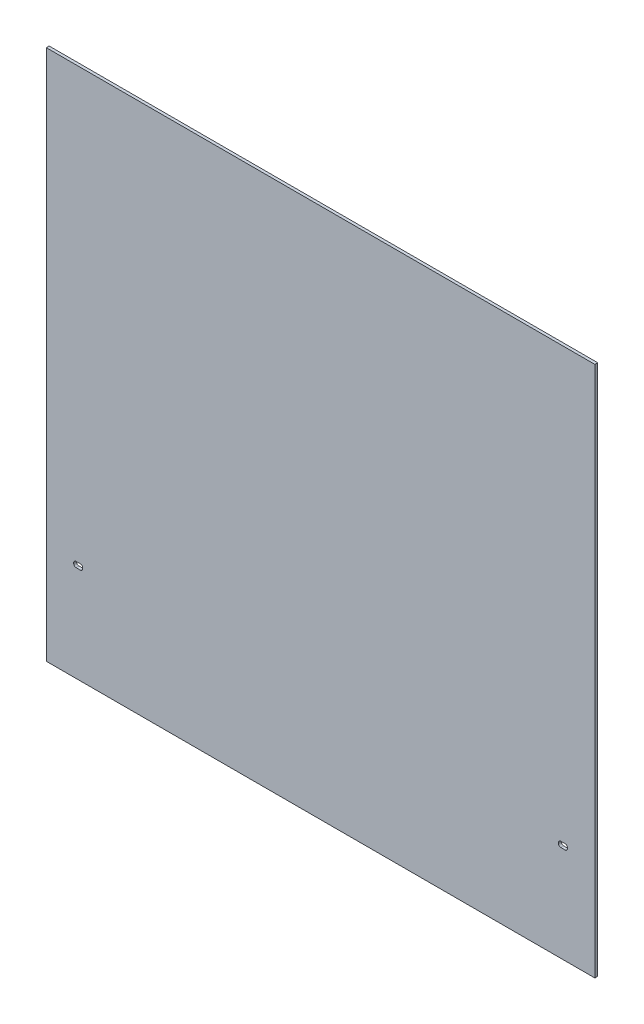
ISO-10303-21;
HEADER;
FILE_DESCRIPTION(('STEP AP214'),'2;1');
FILE_NAME('part.step','',(''),(''),'','','');
FILE_SCHEMA(('AUTOMOTIVE_DESIGN { 1 0 10303 214 1 1 1 1 }'));
ENDSEC;
DATA;
#1=APPLICATION_CONTEXT('core data for automotive mechanical design processes');
#2=APPLICATION_PROTOCOL_DEFINITION('international standard','automotive_design',2000,#1);
#3=PRODUCT_CONTEXT('',#1,'mechanical');
#4=PRODUCT('Part','Part','',(#3));
#5=PRODUCT_RELATED_PRODUCT_CATEGORY('part','',(#4));
#6=PRODUCT_DEFINITION_FORMATION('','',#4);
#7=PRODUCT_DEFINITION_CONTEXT('part definition',#1,'design');
#8=PRODUCT_DEFINITION('design','',#6,#7);
#9=PRODUCT_DEFINITION_SHAPE('','',#8);
#10=(LENGTH_UNIT() NAMED_UNIT(*) SI_UNIT(.MILLI.,.METRE.));
#11=(NAMED_UNIT(*) PLANE_ANGLE_UNIT() SI_UNIT($,.RADIAN.));
#12=(NAMED_UNIT(*) SI_UNIT($,.STERADIAN.) SOLID_ANGLE_UNIT());
#13=UNCERTAINTY_MEASURE_WITH_UNIT(LENGTH_MEASURE(1.E-05),#10,'distance_accuracy_value','');
#14=(GEOMETRIC_REPRESENTATION_CONTEXT(3) GLOBAL_UNCERTAINTY_ASSIGNED_CONTEXT((#13)) GLOBAL_UNIT_ASSIGNED_CONTEXT((#10,
#11,#12)) REPRESENTATION_CONTEXT('',''));
#15=CARTESIAN_POINT('',(0.,0.,0.));
#16=DIRECTION('',(0.,0.,1.));
#17=DIRECTION('',(1.,0.,0.));
#18=AXIS2_PLACEMENT_3D('',#15,#16,#17);
#19=CARTESIAN_POINT('',(0.,0.,3.175));
#20=DIRECTION('',(0.,0.,1.));
#21=DIRECTION('',(1.,0.,0.));
#22=AXIS2_PLACEMENT_3D('',#19,#20,#21);
#23=PLANE('',#22);
#24=DIRECTION('',(0.,1.,0.));
#25=VECTOR('',#24,1.);
#26=CARTESIAN_POINT('',(0.,0.,3.175));
#27=LINE('',#26,#25);
#28=CARTESIAN_POINT('',(0.,0.,3.175));
#29=VERTEX_POINT('',#28);
#30=CARTESIAN_POINT('',(-1.27832667954905E-13,590.55,3.175));
#31=VERTEX_POINT('',#30);
#32=EDGE_CURVE('E304',#29,#31,#27,.T.);
#33=ORIENTED_EDGE('',*,*,#32,.T.);
#34=DIRECTION('',(-1.,0.,0.));
#35=VECTOR('',#34,1.);
#36=CARTESIAN_POINT('',(-1.27832667954905E-13,590.55,3.175));
#37=LINE('',#36,#35);
#38=CARTESIAN_POINT('',(-609.6,590.55,3.175));
#39=VERTEX_POINT('',#38);
#40=EDGE_CURVE('E307',#31,#39,#37,.T.);
#41=ORIENTED_EDGE('',*,*,#40,.T.);
#42=DIRECTION('',(0.,-1.,0.));
#43=VECTOR('',#42,1.);
#44=CARTESIAN_POINT('',(-609.6,0.,3.175));
#45=LINE('',#44,#43);
#46=CARTESIAN_POINT('',(-609.6,0.,3.175));
#47=VERTEX_POINT('',#46);
#48=EDGE_CURVE('E310',#39,#47,#45,.T.);
#49=ORIENTED_EDGE('',*,*,#48,.T.);
#50=DIRECTION('',(1.,0.,0.));
#51=VECTOR('',#50,1.);
#52=CARTESIAN_POINT('',(0.,0.,3.175));
#53=LINE('',#52,#51);
#54=EDGE_CURVE('E312',#47,#29,#53,.T.);
#55=ORIENTED_EDGE('',*,*,#54,.T.);
#56=EDGE_LOOP('',(#33,#41,#49,#55));
#57=FACE_BOUND('',#56,.T.);
#58=DIRECTION('',(1.,0.,0.));
#59=VECTOR('',#58,1.);
#60=CARTESIAN_POINT('',(-576.62,106.68,3.175));
#61=LINE('',#60,#59);
#62=CARTESIAN_POINT('',(-576.62,106.68,3.175));
#63=VERTEX_POINT('',#62);
#64=CARTESIAN_POINT('',(-571.62,106.68,3.175));
#65=VERTEX_POINT('',#64);
#66=EDGE_CURVE('E247',#63,#65,#61,.T.);
#67=ORIENTED_EDGE('',*,*,#66,.F.);
#68=CARTESIAN_POINT('',(-576.62,109.18,3.175));
#69=DIRECTION('',(0.,0.,1.));
#70=DIRECTION('',(1.,0.,0.));
#71=AXIS2_PLACEMENT_3D('',#68,#69,#70);
#72=CIRCLE('',#71,2.50000000000001);
#73=CARTESIAN_POINT('',(-579.12,109.18,3.175));
#74=VERTEX_POINT('',#73);
#75=EDGE_CURVE('E245',#74,#63,#72,.T.);
#76=ORIENTED_EDGE('',*,*,#75,.F.);
#77=DIRECTION('',(-1.11022302462486E-13,-1.,0.));
#78=VECTOR('',#77,1.);
#79=CARTESIAN_POINT('',(-579.12,109.18,3.175));
#80=LINE('',#79,#78);
#81=CARTESIAN_POINT('',(-579.12,110.18,3.175));
#82=VERTEX_POINT('',#81);
#83=EDGE_CURVE('E261',#82,#74,#80,.T.);
#84=ORIENTED_EDGE('',*,*,#83,.F.);
#85=CARTESIAN_POINT('',(-576.62,110.18,3.175));
#86=DIRECTION('',(0.,0.,1.));
#87=DIRECTION('',(-1.,0.,0.));
#88=AXIS2_PLACEMENT_3D('',#85,#86,#87);
#89=CIRCLE('',#88,2.49999999999986);
#90=CARTESIAN_POINT('',(-576.62,112.68,3.175));
#91=VERTEX_POINT('',#90);
#92=EDGE_CURVE('E258',#91,#82,#89,.T.);
#93=ORIENTED_EDGE('',*,*,#92,.F.);
#94=DIRECTION('',(-1.,0.,0.));
#95=VECTOR('',#94,1.);
#96=CARTESIAN_POINT('',(-576.62,112.68,3.175));
#97=LINE('',#96,#95);
#98=CARTESIAN_POINT('',(-571.62,112.68,3.175));
#99=VERTEX_POINT('',#98);
#100=EDGE_CURVE('E256',#99,#91,#97,.T.);
#101=ORIENTED_EDGE('',*,*,#100,.F.);
#102=CARTESIAN_POINT('',(-571.62,110.18,3.175));
#103=DIRECTION('',(0.,0.,1.));
#104=DIRECTION('',(1.,0.,0.));
#105=AXIS2_PLACEMENT_3D('',#102,#103,#104);
#106=CIRCLE('',#105,2.49999999999998);
#107=CARTESIAN_POINT('',(-569.12,110.18,3.175));
#108=VERTEX_POINT('',#107);
#109=EDGE_CURVE('E254',#108,#99,#106,.T.);
#110=ORIENTED_EDGE('',*,*,#109,.F.);
#111=DIRECTION('',(1.11022302462479E-13,1.,0.));
#112=VECTOR('',#111,1.);
#113=CARTESIAN_POINT('',(-569.12,109.18,3.175));
#114=LINE('',#113,#112);
#115=CARTESIAN_POINT('',(-569.12,109.18,3.175));
#116=VERTEX_POINT('',#115);
#117=EDGE_CURVE('E252',#116,#108,#114,.T.);
#118=ORIENTED_EDGE('',*,*,#117,.F.);
#119=CARTESIAN_POINT('',(-571.62,109.18,3.175));
#120=DIRECTION('',(0.,0.,1.));
#121=DIRECTION('',(1.,0.,0.));
#122=AXIS2_PLACEMENT_3D('',#119,#120,#121);
#123=CIRCLE('',#122,2.4999999999999);
#124=EDGE_CURVE('E250',#65,#116,#123,.T.);
#125=ORIENTED_EDGE('',*,*,#124,.F.);
#126=EDGE_LOOP('',(#67,#76,#84,#93,#101,#110,#118,#125));
#127=FACE_BOUND('',#126,.T.);
#128=DIRECTION('',(0.,1.,0.));
#129=VECTOR('',#128,1.);
#130=CARTESIAN_POINT('',(-30.48,109.180000000001,3.175));
#131=LINE('',#130,#129);
#132=CARTESIAN_POINT('',(-30.48,109.180000000001,3.175));
#133=VERTEX_POINT('',#132);
#134=CARTESIAN_POINT('',(-30.48,110.180000000001,3.175));
#135=VERTEX_POINT('',#134);
#136=EDGE_CURVE('E188',#133,#135,#131,.T.);
#137=ORIENTED_EDGE('',*,*,#136,.F.);
#138=CARTESIAN_POINT('',(-32.9799999999999,109.180000000001,3.175));
#139=DIRECTION('',(0.,0.,1.));
#140=DIRECTION('',(-1.,0.,0.));
#141=AXIS2_PLACEMENT_3D('',#138,#139,#140);
#142=CIRCLE('',#141,2.49999999999995);
#143=CARTESIAN_POINT('',(-32.9799999999999,106.680000000001,3.175));
#144=VERTEX_POINT('',#143);
#145=EDGE_CURVE('E180',#144,#133,#142,.T.);
#146=ORIENTED_EDGE('',*,*,#145,.F.);
#147=DIRECTION('',(1.,0.,0.));
#148=VECTOR('',#147,1.);
#149=CARTESIAN_POINT('',(-32.9799999999999,106.680000000001,3.175));
#150=LINE('',#149,#148);
#151=CARTESIAN_POINT('',(-37.9800000000002,106.680000000001,3.175));
#152=VERTEX_POINT('',#151);
#153=EDGE_CURVE('E213',#152,#144,#150,.T.);
#154=ORIENTED_EDGE('',*,*,#153,.F.);
#155=CARTESIAN_POINT('',(-37.9800000000002,109.180000000001,3.175));
#156=DIRECTION('',(0.,0.,1.));
#157=DIRECTION('',(-1.,0.,0.));
#158=AXIS2_PLACEMENT_3D('',#155,#156,#157);
#159=CIRCLE('',#158,2.50000000000002);
#160=CARTESIAN_POINT('',(-40.4800000000003,109.180000000001,3.175));
#161=VERTEX_POINT('',#160);
#162=EDGE_CURVE('E211',#161,#152,#159,.T.);
#163=ORIENTED_EDGE('',*,*,#162,.F.);
#164=DIRECTION('',(0.,-1.,0.));
#165=VECTOR('',#164,1.);
#166=CARTESIAN_POINT('',(-40.4800000000003,109.180000000001,3.175));
#167=LINE('',#166,#165);
#168=CARTESIAN_POINT('',(-40.4800000000002,110.180000000001,3.175));
#169=VERTEX_POINT('',#168);
#170=EDGE_CURVE('E209',#169,#161,#167,.T.);
#171=ORIENTED_EDGE('',*,*,#170,.F.);
#172=CARTESIAN_POINT('',(-37.9800000000002,110.180000000001,3.175));
#173=DIRECTION('',(0.,0.,1.));
#174=DIRECTION('',(-1.,0.,0.));
#175=AXIS2_PLACEMENT_3D('',#172,#173,#174);
#176=CIRCLE('',#175,2.5);
#177=CARTESIAN_POINT('',(-37.9800000000002,112.680000000001,3.175));
#178=VERTEX_POINT('',#177);
#179=EDGE_CURVE('E207',#178,#169,#176,.T.);
#180=ORIENTED_EDGE('',*,*,#179,.F.);
#181=DIRECTION('',(-1.,0.,0.));
#182=VECTOR('',#181,1.);
#183=CARTESIAN_POINT('',(-32.9799999999999,112.680000000001,3.175));
#184=LINE('',#183,#182);
#185=CARTESIAN_POINT('',(-32.9799999999999,112.680000000001,3.175));
#186=VERTEX_POINT('',#185);
#187=EDGE_CURVE('E203',#186,#178,#184,.T.);
#188=ORIENTED_EDGE('',*,*,#187,.F.);
#189=CARTESIAN_POINT('',(-32.9799999999999,110.180000000001,3.175));
#190=DIRECTION('',(0.,0.,1.));
#191=DIRECTION('',(1.,0.,0.));
#192=AXIS2_PLACEMENT_3D('',#189,#190,#191);
#193=CIRCLE('',#192,2.49999999999995);
#194=EDGE_CURVE('E201',#135,#186,#193,.T.);
#195=ORIENTED_EDGE('',*,*,#194,.F.);
#196=EDGE_LOOP('',(#137,#146,#154,#163,#171,#180,#188,#195));
#197=FACE_BOUND('',#196,.T.);
#198=ADVANCED_FACE('F43',(#57,#127,#197),#23,.T.);
#199=CARTESIAN_POINT('',(0.,0.,0.));
#200=DIRECTION('',(0.,0.,1.));
#201=DIRECTION('',(1.,0.,0.));
#202=AXIS2_PLACEMENT_3D('',#199,#200,#201);
#203=PLANE('',#202);
#204=CARTESIAN_POINT('',(-576.62,109.18,0.));
#205=DIRECTION('',(0.,0.,1.));
#206=DIRECTION('',(1.,0.,0.));
#207=AXIS2_PLACEMENT_3D('',#204,#205,#206);
#208=CIRCLE('',#207,2.50000000000001);
#209=CARTESIAN_POINT('',(-579.12,109.18,0.));
#210=VERTEX_POINT('',#209);
#211=CARTESIAN_POINT('',(-576.62,106.68,0.));
#212=VERTEX_POINT('',#211);
#213=EDGE_CURVE('E196',#210,#212,#208,.T.);
#214=ORIENTED_EDGE('',*,*,#213,.T.);
#215=DIRECTION('',(1.,0.,0.));
#216=VECTOR('',#215,1.);
#217=CARTESIAN_POINT('',(-576.62,106.68,0.));
#218=LINE('',#217,#216);
#219=CARTESIAN_POINT('',(-571.62,106.68,0.));
#220=VERTEX_POINT('',#219);
#221=EDGE_CURVE('E266',#212,#220,#218,.T.);
#222=ORIENTED_EDGE('',*,*,#221,.T.);
#223=CARTESIAN_POINT('',(-571.62,109.18,0.));
#224=DIRECTION('',(0.,0.,1.));
#225=DIRECTION('',(1.,0.,0.));
#226=AXIS2_PLACEMENT_3D('',#223,#224,#225);
#227=CIRCLE('',#226,2.4999999999999);
#228=CARTESIAN_POINT('',(-569.12,109.18,0.));
#229=VERTEX_POINT('',#228);
#230=EDGE_CURVE('E269',#220,#229,#227,.T.);
#231=ORIENTED_EDGE('',*,*,#230,.T.);
#232=DIRECTION('',(1.11022302462479E-13,1.,0.));
#233=VECTOR('',#232,1.);
#234=CARTESIAN_POINT('',(-569.12,109.18,0.));
#235=LINE('',#234,#233);
#236=CARTESIAN_POINT('',(-569.12,110.18,0.));
#237=VERTEX_POINT('',#236);
#238=EDGE_CURVE('E272',#229,#237,#235,.T.);
#239=ORIENTED_EDGE('',*,*,#238,.T.);
#240=CARTESIAN_POINT('',(-571.62,110.18,0.));
#241=DIRECTION('',(0.,0.,1.));
#242=DIRECTION('',(1.,0.,0.));
#243=AXIS2_PLACEMENT_3D('',#240,#241,#242);
#244=CIRCLE('',#243,2.49999999999998);
#245=CARTESIAN_POINT('',(-571.62,112.68,0.));
#246=VERTEX_POINT('',#245);
#247=EDGE_CURVE('E275',#237,#246,#244,.T.);
#248=ORIENTED_EDGE('',*,*,#247,.T.);
#249=DIRECTION('',(-1.,0.,0.));
#250=VECTOR('',#249,1.);
#251=CARTESIAN_POINT('',(-576.62,112.68,0.));
#252=LINE('',#251,#250);
#253=CARTESIAN_POINT('',(-576.62,112.68,0.));
#254=VERTEX_POINT('',#253);
#255=EDGE_CURVE('E278',#246,#254,#252,.T.);
#256=ORIENTED_EDGE('',*,*,#255,.T.);
#257=CARTESIAN_POINT('',(-576.62,110.18,0.));
#258=DIRECTION('',(0.,0.,1.));
#259=DIRECTION('',(-1.,0.,0.));
#260=AXIS2_PLACEMENT_3D('',#257,#258,#259);
#261=CIRCLE('',#260,2.49999999999986);
#262=CARTESIAN_POINT('',(-579.12,110.18,0.));
#263=VERTEX_POINT('',#262);
#264=EDGE_CURVE('E281',#254,#263,#261,.T.);
#265=ORIENTED_EDGE('',*,*,#264,.T.);
#266=DIRECTION('',(-1.11022302462486E-13,-1.,0.));
#267=VECTOR('',#266,1.);
#268=CARTESIAN_POINT('',(-579.12,109.18,0.));
#269=LINE('',#268,#267);
#270=EDGE_CURVE('E248',#263,#210,#269,.T.);
#271=ORIENTED_EDGE('',*,*,#270,.T.);
#272=EDGE_LOOP('',(#214,#222,#231,#239,#248,#256,#265,#271));
#273=FACE_BOUND('',#272,.T.);
#274=DIRECTION('',(0.,1.,0.));
#275=VECTOR('',#274,1.);
#276=CARTESIAN_POINT('',(0.,0.,0.));
#277=LINE('',#276,#275);
#278=CARTESIAN_POINT('',(0.,0.,0.));
#279=VERTEX_POINT('',#278);
#280=CARTESIAN_POINT('',(-1.27832667954905E-13,590.55,0.));
#281=VERTEX_POINT('',#280);
#282=EDGE_CURVE('E303',#279,#281,#277,.T.);
#283=ORIENTED_EDGE('',*,*,#282,.F.);
#284=DIRECTION('',(1.,0.,0.));
#285=VECTOR('',#284,1.);
#286=CARTESIAN_POINT('',(0.,0.,0.));
#287=LINE('',#286,#285);
#288=CARTESIAN_POINT('',(-609.6,0.,0.));
#289=VERTEX_POINT('',#288);
#290=EDGE_CURVE('E308',#289,#279,#287,.T.);
#291=ORIENTED_EDGE('',*,*,#290,.F.);
#292=DIRECTION('',(0.,-1.,0.));
#293=VECTOR('',#292,1.);
#294=CARTESIAN_POINT('',(-609.6,0.,0.));
#295=LINE('',#294,#293);
#296=CARTESIAN_POINT('',(-609.6,590.55,0.));
#297=VERTEX_POINT('',#296);
#298=EDGE_CURVE('E319',#297,#289,#295,.T.);
#299=ORIENTED_EDGE('',*,*,#298,.F.);
#300=DIRECTION('',(-1.,0.,0.));
#301=VECTOR('',#300,1.);
#302=CARTESIAN_POINT('',(-1.27832667954905E-13,590.55,0.));
#303=LINE('',#302,#301);
#304=EDGE_CURVE('E317',#281,#297,#303,.T.);
#305=ORIENTED_EDGE('',*,*,#304,.F.);
#306=EDGE_LOOP('',(#283,#291,#299,#305));
#307=FACE_BOUND('',#306,.T.);
#308=CARTESIAN_POINT('',(-32.9799999999999,109.180000000001,0.));
#309=DIRECTION('',(0.,0.,1.));
#310=DIRECTION('',(-1.,0.,0.));
#311=AXIS2_PLACEMENT_3D('',#308,#309,#310);
#312=CIRCLE('',#311,2.49999999999995);
#313=CARTESIAN_POINT('',(-32.9799999999999,106.680000000001,0.));
#314=VERTEX_POINT('',#313);
#315=CARTESIAN_POINT('',(-30.48,109.180000000001,0.));
#316=VERTEX_POINT('',#315);
#317=EDGE_CURVE('E66',#314,#316,#312,.T.);
#318=ORIENTED_EDGE('',*,*,#317,.T.);
#319=DIRECTION('',(0.,1.,0.));
#320=VECTOR('',#319,1.);
#321=CARTESIAN_POINT('',(-30.48,109.180000000001,0.));
#322=LINE('',#321,#320);
#323=CARTESIAN_POINT('',(-30.48,110.180000000001,0.));
#324=VERTEX_POINT('',#323);
#325=EDGE_CURVE('E195',#316,#324,#322,.T.);
#326=ORIENTED_EDGE('',*,*,#325,.T.);
#327=CARTESIAN_POINT('',(-32.9799999999999,110.180000000001,0.));
#328=DIRECTION('',(0.,0.,1.));
#329=DIRECTION('',(1.,0.,0.));
#330=AXIS2_PLACEMENT_3D('',#327,#328,#329);
#331=CIRCLE('',#330,2.49999999999995);
#332=CARTESIAN_POINT('',(-32.9799999999999,112.680000000001,0.));
#333=VERTEX_POINT('',#332);
#334=EDGE_CURVE('E217',#324,#333,#331,.T.);
#335=ORIENTED_EDGE('',*,*,#334,.T.);
#336=DIRECTION('',(-1.,0.,0.));
#337=VECTOR('',#336,1.);
#338=CARTESIAN_POINT('',(-32.9799999999999,112.680000000001,0.));
#339=LINE('',#338,#337);
#340=CARTESIAN_POINT('',(-37.9800000000002,112.680000000001,0.));
#341=VERTEX_POINT('',#340);
#342=EDGE_CURVE('E220',#333,#341,#339,.T.);
#343=ORIENTED_EDGE('',*,*,#342,.T.);
#344=CARTESIAN_POINT('',(-37.9800000000002,110.180000000001,0.));
#345=DIRECTION('',(0.,0.,1.));
#346=DIRECTION('',(-1.,0.,0.));
#347=AXIS2_PLACEMENT_3D('',#344,#345,#346);
#348=CIRCLE('',#347,2.5);
#349=CARTESIAN_POINT('',(-40.4800000000002,110.180000000001,0.));
#350=VERTEX_POINT('',#349);
#351=EDGE_CURVE('E223',#341,#350,#348,.T.);
#352=ORIENTED_EDGE('',*,*,#351,.T.);
#353=DIRECTION('',(0.,-1.,0.));
#354=VECTOR('',#353,1.);
#355=CARTESIAN_POINT('',(-40.4800000000003,109.180000000001,0.));
#356=LINE('',#355,#354);
#357=CARTESIAN_POINT('',(-40.4800000000003,109.180000000001,0.));
#358=VERTEX_POINT('',#357);
#359=EDGE_CURVE('E226',#350,#358,#356,.T.);
#360=ORIENTED_EDGE('',*,*,#359,.T.);
#361=CARTESIAN_POINT('',(-37.9800000000002,109.180000000001,0.));
#362=DIRECTION('',(0.,0.,1.));
#363=DIRECTION('',(-1.,0.,0.));
#364=AXIS2_PLACEMENT_3D('',#361,#362,#363);
#365=CIRCLE('',#364,2.50000000000002);
#366=CARTESIAN_POINT('',(-37.9800000000002,106.680000000001,0.));
#367=VERTEX_POINT('',#366);
#368=EDGE_CURVE('E229',#358,#367,#365,.T.);
#369=ORIENTED_EDGE('',*,*,#368,.T.);
#370=DIRECTION('',(1.,0.,0.));
#371=VECTOR('',#370,1.);
#372=CARTESIAN_POINT('',(-32.9799999999999,106.680000000001,0.));
#373=LINE('',#372,#371);
#374=EDGE_CURVE('E189',#367,#314,#373,.T.);
#375=ORIENTED_EDGE('',*,*,#374,.T.);
#376=EDGE_LOOP('',(#318,#326,#335,#343,#352,#360,#369,#375));
#377=FACE_BOUND('',#376,.T.);
#378=ADVANCED_FACE('F337',(#273,#307,#377),#203,.F.);
#379=CARTESIAN_POINT('',(0.,0.,3.175));
#380=DIRECTION('',(-1.,0.,0.));
#381=DIRECTION('',(0.,-1.,0.));
#382=AXIS2_PLACEMENT_3D('',#379,#380,#381);
#383=PLANE('',#382);
#384=ORIENTED_EDGE('',*,*,#282,.T.);
#385=DIRECTION('',(0.,0.,-1.));
#386=VECTOR('',#385,1.);
#387=CARTESIAN_POINT('',(-1.27832667954905E-13,590.55,3.175));
#388=LINE('',#387,#386);
#389=EDGE_CURVE('E11',#31,#281,#388,.T.);
#390=ORIENTED_EDGE('',*,*,#389,.F.);
#391=ORIENTED_EDGE('',*,*,#32,.F.);
#392=DIRECTION('',(0.,0.,-1.));
#393=VECTOR('',#392,1.);
#394=CARTESIAN_POINT('',(0.,0.,3.175));
#395=LINE('',#394,#393);
#396=EDGE_CURVE('E314',#29,#279,#395,.T.);
#397=ORIENTED_EDGE('',*,*,#396,.T.);
#398=EDGE_LOOP('',(#384,#390,#391,#397));
#399=FACE_BOUND('',#398,.T.);
#400=ADVANCED_FACE('F45',(#399),#383,.F.);
#401=CARTESIAN_POINT('',(-1.27832667954905E-13,590.55,3.175));
#402=DIRECTION('',(0.,-1.,0.));
#403=DIRECTION('',(0.,0.,-1.));
#404=AXIS2_PLACEMENT_3D('',#401,#402,#403);
#405=PLANE('',#404);
#406=ORIENTED_EDGE('',*,*,#304,.T.);
#407=DIRECTION('',(0.,0.,-1.));
#408=VECTOR('',#407,1.);
#409=CARTESIAN_POINT('',(-609.6,590.55,3.175));
#410=LINE('',#409,#408);
#411=EDGE_CURVE('E51',#39,#297,#410,.T.);
#412=ORIENTED_EDGE('',*,*,#411,.F.);
#413=ORIENTED_EDGE('',*,*,#40,.F.);
#414=ORIENTED_EDGE('',*,*,#389,.T.);
#415=EDGE_LOOP('',(#406,#412,#413,#414));
#416=FACE_BOUND('',#415,.T.);
#417=ADVANCED_FACE('F348',(#416),#405,.F.);
#418=CARTESIAN_POINT('',(-609.6,0.,3.175));
#419=DIRECTION('',(1.,0.,0.));
#420=DIRECTION('',(0.,0.,-1.));
#421=AXIS2_PLACEMENT_3D('',#418,#419,#420);
#422=PLANE('',#421);
#423=ORIENTED_EDGE('',*,*,#298,.T.);
#424=DIRECTION('',(0.,0.,-1.));
#425=VECTOR('',#424,1.);
#426=CARTESIAN_POINT('',(-609.6,0.,3.175));
#427=LINE('',#426,#425);
#428=EDGE_CURVE('E324',#47,#289,#427,.T.);
#429=ORIENTED_EDGE('',*,*,#428,.F.);
#430=ORIENTED_EDGE('',*,*,#48,.F.);
#431=ORIENTED_EDGE('',*,*,#411,.T.);
#432=EDGE_LOOP('',(#423,#429,#430,#431));
#433=FACE_BOUND('',#432,.T.);
#434=ADVANCED_FACE('F331',(#433),#422,.F.);
#435=CARTESIAN_POINT('',(0.,0.,3.175));
#436=DIRECTION('',(0.,1.,0.));
#437=DIRECTION('',(-1.,0.,0.));
#438=AXIS2_PLACEMENT_3D('',#435,#436,#437);
#439=PLANE('',#438);
#440=ORIENTED_EDGE('',*,*,#290,.T.);
#441=ORIENTED_EDGE('',*,*,#396,.F.);
#442=ORIENTED_EDGE('',*,*,#54,.F.);
#443=ORIENTED_EDGE('',*,*,#428,.T.);
#444=EDGE_LOOP('',(#440,#441,#442,#443));
#445=FACE_BOUND('',#444,.T.);
#446=ADVANCED_FACE('F341',(#445),#439,.F.);
#447=CARTESIAN_POINT('',(-576.62,109.18,3.175));
#448=DIRECTION('',(0.,0.,-1.));
#449=DIRECTION('',(-1.,0.,0.));
#450=AXIS2_PLACEMENT_3D('',#447,#448,#449);
#451=CYLINDRICAL_SURFACE('',#450,2.50000000000001);
#452=ORIENTED_EDGE('',*,*,#213,.F.);
#453=DIRECTION('',(0.,0.,-1.));
#454=VECTOR('',#453,1.);
#455=CARTESIAN_POINT('',(-579.12,109.18,3.175));
#456=LINE('',#455,#454);
#457=EDGE_CURVE('E263',#74,#210,#456,.T.);
#458=ORIENTED_EDGE('',*,*,#457,.F.);
#459=ORIENTED_EDGE('',*,*,#75,.T.);
#460=DIRECTION('',(0.,0.,-1.));
#461=VECTOR('',#460,1.);
#462=CARTESIAN_POINT('',(-576.62,106.68,3.175));
#463=LINE('',#462,#461);
#464=EDGE_CURVE('E300',#63,#212,#463,.T.);
#465=ORIENTED_EDGE('',*,*,#464,.T.);
#466=EDGE_LOOP('',(#452,#458,#459,#465));
#467=FACE_BOUND('',#466,.T.);
#468=ADVANCED_FACE('F363',(#467),#451,.F.);
#469=CARTESIAN_POINT('',(-576.62,106.68,3.175));
#470=DIRECTION('',(0.,1.,0.));
#471=DIRECTION('',(-1.,0.,0.));
#472=AXIS2_PLACEMENT_3D('',#469,#470,#471);
#473=PLANE('',#472);
#474=ORIENTED_EDGE('',*,*,#221,.F.);
#475=ORIENTED_EDGE('',*,*,#464,.F.);
#476=ORIENTED_EDGE('',*,*,#66,.T.);
#477=DIRECTION('',(0.,0.,-1.));
#478=VECTOR('',#477,1.);
#479=CARTESIAN_POINT('',(-571.62,106.68,3.175));
#480=LINE('',#479,#478);
#481=EDGE_CURVE('E298',#65,#220,#480,.T.);
#482=ORIENTED_EDGE('',*,*,#481,.T.);
#483=EDGE_LOOP('',(#474,#475,#476,#482));
#484=FACE_BOUND('',#483,.T.);
#485=ADVANCED_FACE('F370',(#484),#473,.T.);
#486=CARTESIAN_POINT('',(-571.62,109.18,3.175));
#487=DIRECTION('',(0.,0.,-1.));
#488=DIRECTION('',(-1.,0.,0.));
#489=AXIS2_PLACEMENT_3D('',#486,#487,#488);
#490=CYLINDRICAL_SURFACE('',#489,2.4999999999999);
#491=ORIENTED_EDGE('',*,*,#230,.F.);
#492=ORIENTED_EDGE('',*,*,#481,.F.);
#493=ORIENTED_EDGE('',*,*,#124,.T.);
#494=DIRECTION('',(0.,0.,-1.));
#495=VECTOR('',#494,1.);
#496=CARTESIAN_POINT('',(-569.12,109.18,3.175));
#497=LINE('',#496,#495);
#498=EDGE_CURVE('E296',#116,#229,#497,.T.);
#499=ORIENTED_EDGE('',*,*,#498,.T.);
#500=EDGE_LOOP('',(#491,#492,#493,#499));
#501=FACE_BOUND('',#500,.T.);
#502=ADVANCED_FACE('F375',(#501),#490,.F.);
#503=CARTESIAN_POINT('',(-569.12,109.18,3.175));
#504=DIRECTION('',(-1.,1.11022302462479E-13,0.));
#505=DIRECTION('',(-1.11022302462479E-13,-1.,0.));
#506=AXIS2_PLACEMENT_3D('',#503,#504,#505);
#507=PLANE('',#506);
#508=ORIENTED_EDGE('',*,*,#238,.F.);
#509=ORIENTED_EDGE('',*,*,#498,.F.);
#510=ORIENTED_EDGE('',*,*,#117,.T.);
#511=DIRECTION('',(0.,0.,-1.));
#512=VECTOR('',#511,1.);
#513=CARTESIAN_POINT('',(-569.12,110.18,3.175));
#514=LINE('',#513,#512);
#515=EDGE_CURVE('E294',#108,#237,#514,.T.);
#516=ORIENTED_EDGE('',*,*,#515,.T.);
#517=EDGE_LOOP('',(#508,#509,#510,#516));
#518=FACE_BOUND('',#517,.T.);
#519=ADVANCED_FACE('F400',(#518),#507,.T.);
#520=CARTESIAN_POINT('',(-571.62,110.18,3.175));
#521=DIRECTION('',(0.,0.,-1.));
#522=DIRECTION('',(-1.,0.,0.));
#523=AXIS2_PLACEMENT_3D('',#520,#521,#522);
#524=CYLINDRICAL_SURFACE('',#523,2.49999999999998);
#525=ORIENTED_EDGE('',*,*,#247,.F.);
#526=ORIENTED_EDGE('',*,*,#515,.F.);
#527=ORIENTED_EDGE('',*,*,#109,.T.);
#528=DIRECTION('',(0.,0.,-1.));
#529=VECTOR('',#528,1.);
#530=CARTESIAN_POINT('',(-571.62,112.68,3.175));
#531=LINE('',#530,#529);
#532=EDGE_CURVE('E292',#99,#246,#531,.T.);
#533=ORIENTED_EDGE('',*,*,#532,.T.);
#534=EDGE_LOOP('',(#525,#526,#527,#533));
#535=FACE_BOUND('',#534,.T.);
#536=ADVANCED_FACE('F405',(#535),#524,.F.);
#537=CARTESIAN_POINT('',(-576.62,112.68,3.175));
#538=DIRECTION('',(0.,-1.,0.));
#539=DIRECTION('',(0.,0.,-1.));
#540=AXIS2_PLACEMENT_3D('',#537,#538,#539);
#541=PLANE('',#540);
#542=ORIENTED_EDGE('',*,*,#255,.F.);
#543=ORIENTED_EDGE('',*,*,#532,.F.);
#544=ORIENTED_EDGE('',*,*,#100,.T.);
#545=DIRECTION('',(0.,0.,-1.));
#546=VECTOR('',#545,1.);
#547=CARTESIAN_POINT('',(-576.62,112.68,3.175));
#548=LINE('',#547,#546);
#549=EDGE_CURVE('E290',#91,#254,#548,.T.);
#550=ORIENTED_EDGE('',*,*,#549,.T.);
#551=EDGE_LOOP('',(#542,#543,#544,#550));
#552=FACE_BOUND('',#551,.T.);
#553=ADVANCED_FACE('F408',(#552),#541,.T.);
#554=CARTESIAN_POINT('',(-576.62,110.18,3.175));
#555=DIRECTION('',(0.,0.,-1.));
#556=DIRECTION('',(-1.,0.,0.));
#557=AXIS2_PLACEMENT_3D('',#554,#555,#556);
#558=CYLINDRICAL_SURFACE('',#557,2.49999999999986);
#559=ORIENTED_EDGE('',*,*,#264,.F.);
#560=ORIENTED_EDGE('',*,*,#549,.F.);
#561=ORIENTED_EDGE('',*,*,#92,.T.);
#562=DIRECTION('',(0.,0.,-1.));
#563=VECTOR('',#562,1.);
#564=CARTESIAN_POINT('',(-579.12,110.18,3.175));
#565=LINE('',#564,#563);
#566=EDGE_CURVE('E288',#82,#263,#565,.T.);
#567=ORIENTED_EDGE('',*,*,#566,.T.);
#568=EDGE_LOOP('',(#559,#560,#561,#567));
#569=FACE_BOUND('',#568,.T.);
#570=ADVANCED_FACE('F388',(#569),#558,.F.);
#571=CARTESIAN_POINT('',(-579.12,109.18,3.175));
#572=DIRECTION('',(1.,-1.11022302462486E-13,0.));
#573=DIRECTION('',(1.11022302462486E-13,1.,0.));
#574=AXIS2_PLACEMENT_3D('',#571,#572,#573);
#575=PLANE('',#574);
#576=ORIENTED_EDGE('',*,*,#270,.F.);
#577=ORIENTED_EDGE('',*,*,#566,.F.);
#578=ORIENTED_EDGE('',*,*,#83,.T.);
#579=ORIENTED_EDGE('',*,*,#457,.T.);
#580=EDGE_LOOP('',(#576,#577,#578,#579));
#581=FACE_BOUND('',#580,.T.);
#582=ADVANCED_FACE('F382',(#581),#575,.T.);
#583=CARTESIAN_POINT('',(-32.9799999999999,109.180000000001,3.175));
#584=DIRECTION('',(0.,0.,-1.));
#585=DIRECTION('',(-1.,0.,0.));
#586=AXIS2_PLACEMENT_3D('',#583,#584,#585);
#587=CYLINDRICAL_SURFACE('',#586,2.49999999999995);
#588=ORIENTED_EDGE('',*,*,#317,.F.);
#589=DIRECTION('',(0.,0.,-1.));
#590=VECTOR('',#589,1.);
#591=CARTESIAN_POINT('',(-32.9799999999999,106.680000000001,3.175));
#592=LINE('',#591,#590);
#593=EDGE_CURVE('E184',#144,#314,#592,.T.);
#594=ORIENTED_EDGE('',*,*,#593,.F.);
#595=ORIENTED_EDGE('',*,*,#145,.T.);
#596=DIRECTION('',(0.,0.,-1.));
#597=VECTOR('',#596,1.);
#598=CARTESIAN_POINT('',(-30.48,109.180000000001,3.175));
#599=LINE('',#598,#597);
#600=EDGE_CURVE('E183',#133,#316,#599,.T.);
#601=ORIENTED_EDGE('',*,*,#600,.T.);
#602=EDGE_LOOP('',(#588,#594,#595,#601));
#603=FACE_BOUND('',#602,.T.);
#604=ADVANCED_FACE('F182',(#603),#587,.F.);
#605=CARTESIAN_POINT('',(-30.48,109.180000000001,3.175));
#606=DIRECTION('',(-1.,0.,0.));
#607=DIRECTION('',(0.,0.,1.));
#608=AXIS2_PLACEMENT_3D('',#605,#606,#607);
#609=PLANE('',#608);
#610=ORIENTED_EDGE('',*,*,#325,.F.);
#611=ORIENTED_EDGE('',*,*,#600,.F.);
#612=ORIENTED_EDGE('',*,*,#136,.T.);
#613=DIRECTION('',(0.,0.,-1.));
#614=VECTOR('',#613,1.);
#615=CARTESIAN_POINT('',(-30.48,110.180000000001,3.175));
#616=LINE('',#615,#614);
#617=EDGE_CURVE('E197',#135,#324,#616,.T.);
#618=ORIENTED_EDGE('',*,*,#617,.T.);
#619=EDGE_LOOP('',(#610,#611,#612,#618));
#620=FACE_BOUND('',#619,.T.);
#621=ADVANCED_FACE('F192',(#620),#609,.T.);
#622=CARTESIAN_POINT('',(-32.9799999999999,110.180000000001,3.175));
#623=DIRECTION('',(0.,0.,-1.));
#624=DIRECTION('',(-1.,0.,0.));
#625=AXIS2_PLACEMENT_3D('',#622,#623,#624);
#626=CYLINDRICAL_SURFACE('',#625,2.49999999999995);
#627=ORIENTED_EDGE('',*,*,#334,.F.);
#628=ORIENTED_EDGE('',*,*,#617,.F.);
#629=ORIENTED_EDGE('',*,*,#194,.T.);
#630=DIRECTION('',(0.,0.,-1.));
#631=VECTOR('',#630,1.);
#632=CARTESIAN_POINT('',(-32.9799999999999,112.680000000001,3.175));
#633=LINE('',#632,#631);
#634=EDGE_CURVE('E242',#186,#333,#633,.T.);
#635=ORIENTED_EDGE('',*,*,#634,.T.);
#636=EDGE_LOOP('',(#627,#628,#629,#635));
#637=FACE_BOUND('',#636,.T.);
#638=ADVANCED_FACE('F473',(#637),#626,.F.);
#639=CARTESIAN_POINT('',(-32.9799999999999,112.680000000001,3.175));
#640=DIRECTION('',(0.,-1.,0.));
#641=DIRECTION('',(0.,0.,-1.));
#642=AXIS2_PLACEMENT_3D('',#639,#640,#641);
#643=PLANE('',#642);
#644=ORIENTED_EDGE('',*,*,#342,.F.);
#645=ORIENTED_EDGE('',*,*,#634,.F.);
#646=ORIENTED_EDGE('',*,*,#187,.T.);
#647=DIRECTION('',(0.,0.,-1.));
#648=VECTOR('',#647,1.);
#649=CARTESIAN_POINT('',(-37.9800000000002,112.680000000001,3.175));
#650=LINE('',#649,#648);
#651=EDGE_CURVE('E240',#178,#341,#650,.T.);
#652=ORIENTED_EDGE('',*,*,#651,.T.);
#653=EDGE_LOOP('',(#644,#645,#646,#652));
#654=FACE_BOUND('',#653,.T.);
#655=ADVANCED_FACE('F483',(#654),#643,.T.);
#656=CARTESIAN_POINT('',(-37.9800000000002,110.180000000001,3.175));
#657=DIRECTION('',(0.,0.,-1.));
#658=DIRECTION('',(-1.,0.,0.));
#659=AXIS2_PLACEMENT_3D('',#656,#657,#658);
#660=CYLINDRICAL_SURFACE('',#659,2.5);
#661=ORIENTED_EDGE('',*,*,#351,.F.);
#662=ORIENTED_EDGE('',*,*,#651,.F.);
#663=ORIENTED_EDGE('',*,*,#179,.T.);
#664=DIRECTION('',(0.,0.,-1.));
#665=VECTOR('',#664,1.);
#666=CARTESIAN_POINT('',(-40.4800000000002,110.180000000001,3.175));
#667=LINE('',#666,#665);
#668=EDGE_CURVE('E238',#169,#350,#667,.T.);
#669=ORIENTED_EDGE('',*,*,#668,.T.);
#670=EDGE_LOOP('',(#661,#662,#663,#669));
#671=FACE_BOUND('',#670,.T.);
#672=ADVANCED_FACE('F494',(#671),#660,.F.);
#673=CARTESIAN_POINT('',(-40.4800000000003,109.180000000001,3.175));
#674=DIRECTION('',(1.,0.,0.));
#675=DIRECTION('',(0.,0.,-1.));
#676=AXIS2_PLACEMENT_3D('',#673,#674,#675);
#677=PLANE('',#676);
#678=ORIENTED_EDGE('',*,*,#359,.F.);
#679=ORIENTED_EDGE('',*,*,#668,.F.);
#680=ORIENTED_EDGE('',*,*,#170,.T.);
#681=DIRECTION('',(0.,0.,-1.));
#682=VECTOR('',#681,1.);
#683=CARTESIAN_POINT('',(-40.4800000000003,109.180000000001,3.175));
#684=LINE('',#683,#682);
#685=EDGE_CURVE('E236',#161,#358,#684,.T.);
#686=ORIENTED_EDGE('',*,*,#685,.T.);
#687=EDGE_LOOP('',(#678,#679,#680,#686));
#688=FACE_BOUND('',#687,.T.);
#689=ADVANCED_FACE('F505',(#688),#677,.T.);
#690=CARTESIAN_POINT('',(-37.9800000000002,109.180000000001,3.175));
#691=DIRECTION('',(0.,0.,-1.));
#692=DIRECTION('',(-1.,0.,0.));
#693=AXIS2_PLACEMENT_3D('',#690,#691,#692);
#694=CYLINDRICAL_SURFACE('',#693,2.50000000000002);
#695=ORIENTED_EDGE('',*,*,#368,.F.);
#696=ORIENTED_EDGE('',*,*,#685,.F.);
#697=ORIENTED_EDGE('',*,*,#162,.T.);
#698=DIRECTION('',(0.,0.,-1.));
#699=VECTOR('',#698,1.);
#700=CARTESIAN_POINT('',(-37.9800000000002,106.680000000001,3.175));
#701=LINE('',#700,#699);
#702=EDGE_CURVE('E58',#152,#367,#701,.T.);
#703=ORIENTED_EDGE('',*,*,#702,.T.);
#704=EDGE_LOOP('',(#695,#696,#697,#703));
#705=FACE_BOUND('',#704,.T.);
#706=ADVANCED_FACE('F516',(#705),#694,.F.);
#707=CARTESIAN_POINT('',(-32.9799999999999,106.680000000001,3.175));
#708=DIRECTION('',(0.,1.,0.));
#709=DIRECTION('',(-1.,0.,0.));
#710=AXIS2_PLACEMENT_3D('',#707,#708,#709);
#711=PLANE('',#710);
#712=ORIENTED_EDGE('',*,*,#374,.F.);
#713=ORIENTED_EDGE('',*,*,#702,.F.);
#714=ORIENTED_EDGE('',*,*,#153,.T.);
#715=ORIENTED_EDGE('',*,*,#593,.T.);
#716=EDGE_LOOP('',(#712,#713,#714,#715));
#717=FACE_BOUND('',#716,.T.);
#718=ADVANCED_FACE('F527',(#717),#711,.T.);
#719=CLOSED_SHELL('',(#198,#378,#400,#417,#434,#446,#468,#485,#502,#519,#536,#553,#570,#582,
#604,#621,#638,#655,#672,#689,#706,#718));
#720=MANIFOLD_SOLID_BREP('B2',#719);
#721=ADVANCED_BREP_SHAPE_REPRESENTATION('',(#18,#720),#14);
#722=SHAPE_DEFINITION_REPRESENTATION(#9,#721);
ENDSEC;
END-ISO-10303-21;
